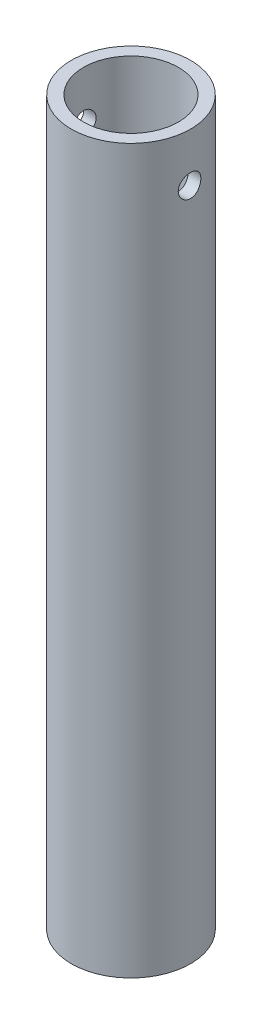
ISO-10303-21;
HEADER;
FILE_DESCRIPTION(('STEP AP214'),'2;1');
FILE_NAME('part.step','',(''),(''),'','','');
FILE_SCHEMA(('AUTOMOTIVE_DESIGN { 1 0 10303 214 1 1 1 1 }'));
ENDSEC;
DATA;
#1=APPLICATION_CONTEXT('core data for automotive mechanical design processes');
#2=APPLICATION_PROTOCOL_DEFINITION('international standard','automotive_design',2000,#1);
#3=PRODUCT_CONTEXT('',#1,'mechanical');
#4=PRODUCT('Part','Part','',(#3));
#5=PRODUCT_RELATED_PRODUCT_CATEGORY('part','',(#4));
#6=PRODUCT_DEFINITION_FORMATION('','',#4);
#7=PRODUCT_DEFINITION_CONTEXT('part definition',#1,'design');
#8=PRODUCT_DEFINITION('design','',#6,#7);
#9=PRODUCT_DEFINITION_SHAPE('','',#8);
#10=(LENGTH_UNIT() NAMED_UNIT(*) SI_UNIT(.MILLI.,.METRE.));
#11=(NAMED_UNIT(*) PLANE_ANGLE_UNIT() SI_UNIT($,.RADIAN.));
#12=(NAMED_UNIT(*) SI_UNIT($,.STERADIAN.) SOLID_ANGLE_UNIT());
#13=UNCERTAINTY_MEASURE_WITH_UNIT(LENGTH_MEASURE(1.E-05),#10,'distance_accuracy_value','');
#14=(GEOMETRIC_REPRESENTATION_CONTEXT(3) GLOBAL_UNCERTAINTY_ASSIGNED_CONTEXT((#13)) GLOBAL_UNIT_ASSIGNED_CONTEXT((#10,
#11,#12)) REPRESENTATION_CONTEXT('',''));
#15=CARTESIAN_POINT('',(0.,0.,0.));
#16=DIRECTION('',(0.,0.,1.));
#17=DIRECTION('',(1.,0.,0.));
#18=AXIS2_PLACEMENT_3D('',#15,#16,#17);
#19=CARTESIAN_POINT('',(-19.05,87.884,0.));
#20=DIRECTION('',(1.,0.,0.));
#21=DIRECTION('',(0.,1.,0.));
#22=AXIS2_PLACEMENT_3D('',#19,#20,#21);
#23=CYLINDRICAL_SURFACE('',#22,3.175);
#24=CARTESIAN_POINT('',(-16.4605914535292,87.884,3.175));
#25=CARTESIAN_POINT('',(-16.4605955713524,87.7075637329182,3.17499162485741));
#26=CARTESIAN_POINT('',(-16.4634616659425,87.5309061569688,3.16022982100423));
#27=CARTESIAN_POINT('',(-16.4746103196371,87.1824362642483,3.1015748491811));
#28=CARTESIAN_POINT('',(-16.482903712911,87.0106343576768,3.05762340919395));
#29=CARTESIAN_POINT('',(-16.5039342673924,86.6771743088839,2.94198525528433));
#30=CARTESIAN_POINT('',(-16.5166652590602,86.5155024492415,2.87033703286516));
#31=CARTESIAN_POINT('',(-16.5451282967864,86.206531513449,2.70143027149794));
#32=CARTESIAN_POINT('',(-16.5608593171774,86.0592275510576,2.60418048105422));
#33=CARTESIAN_POINT('',(-16.5937773870769,85.7812217923527,2.38549383997687));
#34=CARTESIAN_POINT('',(-16.6109790857533,85.6507301327012,2.26379199507614));
#35=CARTESIAN_POINT('',(-16.6447717073201,85.4118818070809,2.00022292090288));
#36=CARTESIAN_POINT('',(-16.661362557352,85.3035277745917,1.858353295883));
#37=CARTESIAN_POINT('',(-16.6922183889322,85.1112415233391,1.55711488166798));
#38=CARTESIAN_POINT('',(-16.7064643271996,85.0275052969996,1.39761886877199));
#39=CARTESIAN_POINT('',(-16.7308629866847,84.8880957175899,1.06650899254171));
#40=CARTESIAN_POINT('',(-16.7410160861486,84.8324197711653,0.894896250717597));
#41=CARTESIAN_POINT('',(-16.7559827785661,84.7513544187384,0.546580656825547));
#42=CARTESIAN_POINT('',(-16.7608582039182,84.7256140207742,0.369962193862704));
#43=CARTESIAN_POINT('',(-16.7649334075229,84.7040566116156,0.0148505250254451));
#44=CARTESIAN_POINT('',(-16.7641336694501,84.7082370503722,-0.163642519790199));
#45=CARTESIAN_POINT('',(-16.7569969250143,84.7461338255129,-0.51502699271231));
#46=CARTESIAN_POINT('',(-16.7507308248,84.7794719610584,-0.687960858224349));
#47=CARTESIAN_POINT('',(-16.7334449474204,84.8741398323728,-1.02573598186136));
#48=CARTESIAN_POINT('',(-16.722424957571,84.9354708205198,-1.19057687754778));
#49=CARTESIAN_POINT('',(-16.6967508581894,85.0847445535536,-1.50858464968854));
#50=CARTESIAN_POINT('',(-16.6820761381327,85.1728388694797,-1.66167864595414));
#51=CARTESIAN_POINT('',(-16.6507161755429,85.3730198639544,-1.95104063352492));
#52=CARTESIAN_POINT('',(-16.6340308745571,85.4851072401137,-2.08730813540932));
#53=CARTESIAN_POINT('',(-16.6001910903129,85.7321534616203,-2.34138006933843));
#54=CARTESIAN_POINT('',(-16.5830333416339,85.8674391747914,-2.45886641674243));
#55=CARTESIAN_POINT('',(-16.5504209365188,86.15603036559,-2.66958282596964));
#56=CARTESIAN_POINT('',(-16.5349670417288,86.309343839101,-2.76280206520241));
#57=CARTESIAN_POINT('',(-16.5075051510863,86.6301079940236,-2.92242577276076));
#58=CARTESIAN_POINT('',(-16.4955060391128,86.7975937145556,-2.98876128554039));
#59=CARTESIAN_POINT('',(-16.4764451364828,87.141395372795,-3.09212840865768));
#60=CARTESIAN_POINT('',(-16.4693729336149,87.3176918396095,-3.12922183930354));
#61=CARTESIAN_POINT('',(-16.4636506876963,87.5600912612585,-3.15910411285925));
#62=CARTESIAN_POINT('',(-16.4625061188877,87.6247154787923,-3.16506004880969));
#63=CARTESIAN_POINT('',(-16.4609757438165,87.7542164805012,-3.17300953582733));
#64=CARTESIAN_POINT('',(-16.4605899386794,87.8190932650508,-3.17500308101712));
#65=CARTESIAN_POINT('',(-16.4605955713524,88.0604362670817,-3.17499162485741));
#66=CARTESIAN_POINT('',(-16.4634616659425,88.2370938430311,-3.16022982100422));
#67=CARTESIAN_POINT('',(-16.4746103196371,88.5855637357516,-3.1015748491811));
#68=CARTESIAN_POINT('',(-16.482903712911,88.7573656423232,-3.05762340919395));
#69=CARTESIAN_POINT('',(-16.5039342673924,89.090825691116,-2.94198525528433));
#70=CARTESIAN_POINT('',(-16.5166652590602,89.2524975507584,-2.87033703286516));
#71=CARTESIAN_POINT('',(-16.5451282967864,89.5614684865509,-2.70143027149794));
#72=CARTESIAN_POINT('',(-16.5608593171774,89.7087724489423,-2.60418048105422));
#73=CARTESIAN_POINT('',(-16.5937773870769,89.9867782076472,-2.38549383997687));
#74=CARTESIAN_POINT('',(-16.6109790857533,90.1172698672987,-2.26379199507614));
#75=CARTESIAN_POINT('',(-16.6447717073201,90.356118192919,-2.00022292090288));
#76=CARTESIAN_POINT('',(-16.661362557352,90.4644722254083,-1.858353295883));
#77=CARTESIAN_POINT('',(-16.6922183889322,90.6567584766608,-1.55711488166798));
#78=CARTESIAN_POINT('',(-16.7064643271996,90.7404947030003,-1.39761886877198));
#79=CARTESIAN_POINT('',(-16.7308629866847,90.87990428241,-1.0665089925417));
#80=CARTESIAN_POINT('',(-16.7410160861486,90.9355802288347,-0.894896250717595));
#81=CARTESIAN_POINT('',(-16.7559827785661,91.0166455812615,-0.546580656825547));
#82=CARTESIAN_POINT('',(-16.7608582039182,91.0423859792257,-0.369962193862704));
#83=CARTESIAN_POINT('',(-16.7649334075229,91.0639433883843,-0.014850525025445));
#84=CARTESIAN_POINT('',(-16.7641336694501,91.0597629496277,0.163642519790199));
#85=CARTESIAN_POINT('',(-16.7569969250143,91.021866174487,0.51502699271231));
#86=CARTESIAN_POINT('',(-16.7507308248,90.9885280389415,0.687960858224349));
#87=CARTESIAN_POINT('',(-16.7334449474204,90.8938601676271,1.02573598186136));
#88=CARTESIAN_POINT('',(-16.722424957571,90.8325291794801,1.19057687754778));
#89=CARTESIAN_POINT('',(-16.6967508581894,90.6832554464463,1.50858464968854));
#90=CARTESIAN_POINT('',(-16.6820761381327,90.5951611305202,1.66167864595414));
#91=CARTESIAN_POINT('',(-16.6507161755429,90.3949801360455,1.95104063352492));
#92=CARTESIAN_POINT('',(-16.6340308745571,90.2828927598862,2.08730813540932));
#93=CARTESIAN_POINT('',(-16.6001910903129,90.0358465383796,2.34138006933844));
#94=CARTESIAN_POINT('',(-16.5830333416339,89.9005608252086,2.45886641674243));
#95=CARTESIAN_POINT('',(-16.5504209365188,89.6119696344099,2.66958282596964));
#96=CARTESIAN_POINT('',(-16.5349670417288,89.4586561608989,2.76280206520241));
#97=CARTESIAN_POINT('',(-16.5075051510863,89.1378920059763,2.92242577276077));
#98=CARTESIAN_POINT('',(-16.4955060391128,88.9704062854444,2.98876128554039));
#99=CARTESIAN_POINT('',(-16.4764451364828,88.626604627205,3.09212840865768));
#100=CARTESIAN_POINT('',(-16.4693729336149,88.4503081603904,3.12922183930354));
#101=CARTESIAN_POINT('',(-16.4636506876963,88.2079087387414,3.15910411285925));
#102=CARTESIAN_POINT('',(-16.4625061188877,88.1432845212076,3.16506004880969));
#103=CARTESIAN_POINT('',(-16.4609757438165,88.0137835194987,3.17300953582733));
#104=CARTESIAN_POINT('',(-16.4605899386794,87.9489067349491,3.17500308101712));
#105=CARTESIAN_POINT('',(-16.4605914535292,87.884,3.175));
#106=B_SPLINE_CURVE_WITH_KNOTS('',3,(#24,#25,#26,#27,#28,#29,#30,#31,#32,#33,#34,#35,#36,#37,
#38,#39,#40,#41,#42,#43,#44,#45,#46,#47,#48,#49,#50,#51,#52,#53,#54,#55,#56,#57,#58,#59,#60,#61,
#62,#63,#64,#65,#66,#67,#68,#69,#70,#71,#72,#73,#74,#75,#76,#77,#78,#79,#80,#81,#82,#83,#84,#85,
#86,#87,#88,#89,#90,#91,#92,#93,#94,#95,#96,#97,#98,#99,#100,#101,#102,#103,#104,#105),
.UNSPECIFIED.,.T.,.F.,(4,2,2,2,2,2,2,2,2,2,2,2,2,2,2,2,2,2,2,2,2,2,2,2,2,2,2,2,2,2,2,2,2,2,2,2,
2,2,2,2,4),(0.,0.529060607442751,1.05918057968992,1.5885664529977,2.11777166016638,
2.65305559998263,3.18840317984082,3.7279041202695,4.26735519042289,4.80041535553215,
5.33343009031626,5.85963201062706,6.38585747510327,6.91512054214377,7.44439899987461,
7.98186187797096,8.51956404349711,9.05863679237908,9.59656681525894,9.79119542677705,
9.98582432698736,10.5148849344301,11.0450049066773,11.574390779985,12.1035959871537,
12.63887992697,13.1742275068282,13.7137284472568,14.2531795174102,14.7862396825195,
15.3192544173036,15.8454563376144,16.3716818020906,16.9009448691311,17.430223326862,
17.9676862049583,18.5053883704845,19.0444611193664,19.5823911422463,19.7770197537644,
19.9716486539747),.UNSPECIFIED.);
#107=CARTESIAN_POINT('',(-16.4605914535292,87.884,3.175));
#108=VERTEX_POINT('',#107);
#109=EDGE_CURVE('E82',#108,#108,#106,.T.);
#110=ORIENTED_EDGE('',*,*,#109,.F.);
#111=EDGE_LOOP('',(#110));
#112=FACE_BOUND('',#111,.T.);
#113=CARTESIAN_POINT('',(-12.9515095645257,87.884,-3.175));
#114=CARTESIAN_POINT('',(-12.9515150321543,88.0594091033922,-3.17499110349409));
#115=CARTESIAN_POINT('',(-12.9551158878673,88.2350280599661,-3.16039928544589));
#116=CARTESIAN_POINT('',(-12.9691119406215,88.5813940737255,-3.1024524091018));
#117=CARTESIAN_POINT('',(-12.9795201677325,88.7521311309278,-3.05904218676037));
#118=CARTESIAN_POINT('',(-13.0058849015107,89.0834463566092,-2.94492512448011));
#119=CARTESIAN_POINT('',(-13.0218319038614,89.2440413740835,-2.87426502147401));
#120=CARTESIAN_POINT('',(-13.0574650521871,89.5510578474195,-2.70777495481837));
#121=CARTESIAN_POINT('',(-13.0771501936582,89.6974830950282,-2.61195175029665));
#122=CARTESIAN_POINT('',(-13.1184873948164,89.9750060808147,-2.39578966504888));
#123=CARTESIAN_POINT('',(-13.1401686144177,90.1057782933303,-2.27503831328109));
#124=CARTESIAN_POINT('',(-13.1828021034695,90.3454243938623,-2.01333114282377));
#125=CARTESIAN_POINT('',(-13.2037542695182,90.4542951859781,-1.87237247252157));
#126=CARTESIAN_POINT('',(-13.2428857484358,90.6483435411072,-1.57206281015363));
#127=CARTESIAN_POINT('',(-13.2610269464954,90.7332064826394,-1.41250312607639));
#128=CARTESIAN_POINT('',(-13.2921636292067,90.8747875015334,-1.0808821767031));
#129=CARTESIAN_POINT('',(-13.3051598413722,90.9315095583734,-0.908822682986226));
#130=CARTESIAN_POINT('',(-13.3243376644445,91.0141710410442,-0.560453850177033));
#131=CARTESIAN_POINT('',(-13.3306405683355,91.0406590416327,-0.384281469358428));
#132=CARTESIAN_POINT('',(-13.3361433306089,91.0638197526484,-0.0298881721607867));
#133=CARTESIAN_POINT('',(-13.3353441357289,91.0604964370407,0.148332468014021));
#134=CARTESIAN_POINT('',(-13.32682400396,91.0245290208186,0.497966067241963));
#135=CARTESIAN_POINT('',(-13.3192428286254,90.9924769307163,0.669443841416427));
#136=CARTESIAN_POINT('',(-13.2981718085659,90.9009097480018,1.00451495043173));
#137=CARTESIAN_POINT('',(-13.2846816269708,90.8413930896344,1.1681078351676));
#138=CARTESIAN_POINT('',(-13.253089742956,90.6960877605275,1.48436137691401));
#139=CARTESIAN_POINT('',(-13.2349501957408,90.6100822592147,1.63691847321283));
#140=CARTESIAN_POINT('',(-13.1960375214372,90.4144100777499,1.92563514925832));
#141=CARTESIAN_POINT('',(-13.1752641545099,90.3047412421469,2.06179323348657));
#142=CARTESIAN_POINT('',(-13.1327554217859,90.0616825070356,2.31736388145479));
#143=CARTESIAN_POINT('',(-13.1110089519818,89.927778707188,2.43628628346194));
#144=CARTESIAN_POINT('',(-13.0694641086944,89.641638086415,2.65013980561741));
#145=CARTESIAN_POINT('',(-13.0496666021758,89.4893931731068,2.74506027808236));
#146=CARTESIAN_POINT('',(-13.0142219462647,89.1699536961075,2.90848853384649));
#147=CARTESIAN_POINT('',(-12.9985952234592,89.0026907303876,2.97686704245557));
#148=CARTESIAN_POINT('',(-12.9735373309936,88.6587902073051,3.08425746944338));
#149=CARTESIAN_POINT('',(-12.9640931185848,88.4821732403046,3.12333123524721));
#150=CARTESIAN_POINT('',(-12.9560521978739,88.2341044219745,3.15642128515628));
#151=CARTESIAN_POINT('',(-12.9543531041202,88.164286071652,3.16338173213881));
#152=CARTESIAN_POINT('',(-12.9520806920144,88.0243230117147,3.17267287613199));
#153=CARTESIAN_POINT('',(-12.9515073770173,87.954178301128,3.17500355934588));
#154=CARTESIAN_POINT('',(-12.9515150321543,87.7085908966077,3.17499110349409));
#155=CARTESIAN_POINT('',(-12.9551158878673,87.5329719400338,3.16039928544589));
#156=CARTESIAN_POINT('',(-12.9691119406215,87.1866059262744,3.1024524091018));
#157=CARTESIAN_POINT('',(-12.9795201677325,87.0158688690722,3.05904218676037));
#158=CARTESIAN_POINT('',(-13.0058849015107,86.6845536433907,2.94492512448011));
#159=CARTESIAN_POINT('',(-13.0218319038614,86.5239586259164,2.87426502147401));
#160=CARTESIAN_POINT('',(-13.0574650521871,86.2169421525804,2.70777495481837));
#161=CARTESIAN_POINT('',(-13.0771501936582,86.0705169049717,2.61195175029665));
#162=CARTESIAN_POINT('',(-13.1184873948164,85.7929939191852,2.39578966504888));
#163=CARTESIAN_POINT('',(-13.1401686144177,85.6622217066696,2.27503831328109));
#164=CARTESIAN_POINT('',(-13.1828021034695,85.4225756061376,2.01333114282377));
#165=CARTESIAN_POINT('',(-13.2037542695182,85.3137048140218,1.87237247252157));
#166=CARTESIAN_POINT('',(-13.2428857484358,85.1196564588927,1.57206281015362));
#167=CARTESIAN_POINT('',(-13.2610269464954,85.0347935173605,1.41250312607639));
#168=CARTESIAN_POINT('',(-13.2921636292067,84.8932124984666,1.0808821767031));
#169=CARTESIAN_POINT('',(-13.3051598413722,84.8364904416265,0.908822682986224));
#170=CARTESIAN_POINT('',(-13.3243376644445,84.7538289589557,0.560453850177034));
#171=CARTESIAN_POINT('',(-13.3306405683355,84.7273409583672,0.384281469358429));
#172=CARTESIAN_POINT('',(-13.3361433306089,84.7041802473515,0.0298881721607874));
#173=CARTESIAN_POINT('',(-13.3353441357289,84.7075035629592,-0.148332468014021));
#174=CARTESIAN_POINT('',(-13.32682400396,84.7434709791814,-0.497966067241963));
#175=CARTESIAN_POINT('',(-13.3192428286254,84.7755230692837,-0.669443841416427));
#176=CARTESIAN_POINT('',(-13.2981718085659,84.8670902519981,-1.00451495043173));
#177=CARTESIAN_POINT('',(-13.2846816269708,84.9266069103655,-1.1681078351676));
#178=CARTESIAN_POINT('',(-13.253089742956,85.0719122394725,-1.48436137691401));
#179=CARTESIAN_POINT('',(-13.2349501957408,85.1579177407852,-1.63691847321283));
#180=CARTESIAN_POINT('',(-13.1960375214372,85.35358992225,-1.92563514925832));
#181=CARTESIAN_POINT('',(-13.1752641545099,85.463258757853,-2.06179323348657));
#182=CARTESIAN_POINT('',(-13.1327554217859,85.7063174929643,-2.31736388145478));
#183=CARTESIAN_POINT('',(-13.1110089519818,85.8402212928119,-2.43628628346193));
#184=CARTESIAN_POINT('',(-13.0694641086944,86.1263619135849,-2.6501398056174));
#185=CARTESIAN_POINT('',(-13.0496666021758,86.2786068268931,-2.74506027808235));
#186=CARTESIAN_POINT('',(-13.0142219462647,86.5980463038924,-2.90848853384649));
#187=CARTESIAN_POINT('',(-12.9985952234592,86.7653092696124,-2.97686704245557));
#188=CARTESIAN_POINT('',(-12.9735373309936,87.1092097926948,-3.08425746944338));
#189=CARTESIAN_POINT('',(-12.9640931185848,87.2858267596953,-3.12333123524721));
#190=CARTESIAN_POINT('',(-12.9560521978739,87.5338955780254,-3.15642128515628));
#191=CARTESIAN_POINT('',(-12.9543531041202,87.6037139283479,-3.16338173213881));
#192=CARTESIAN_POINT('',(-12.9520806920144,87.7436769882853,-3.17267287613199));
#193=CARTESIAN_POINT('',(-12.9515073770173,87.813821698872,-3.17500355934588));
#194=CARTESIAN_POINT('',(-12.9515095645257,87.884,-3.175));
#195=B_SPLINE_CURVE_WITH_KNOTS('',3,(#113,#114,#115,#116,#117,#118,#119,#120,#121,#122,#123,
#124,#125,#126,#127,#128,#129,#130,#131,#132,#133,#134,#135,#136,#137,#138,#139,#140,#141,#142,
#143,#144,#145,#146,#147,#148,#149,#150,#151,#152,#153,#154,#155,#156,#157,#158,#159,#160,#161,
#162,#163,#164,#165,#166,#167,#168,#169,#170,#171,#172,#173,#174,#175,#176,#177,#178,#179,#180,
#181,#182,#183,#184,#185,#186,#187,#188,#189,#190,#191,#192,#193,#194),.UNSPECIFIED.,.T.,.F.,(4,
2,2,2,2,2,2,2,2,2,2,2,2,2,2,2,2,2,2,2,2,2,2,2,2,2,2,2,2,2,2,2,2,2,2,2,2,2,2,2,4),(0.,
0.52595793685034,1.05292557398116,1.57899338711993,2.10492003606811,2.64036920450116,
3.17589400886909,3.71814216305199,4.26031361459001,4.7924830697087,5.32458158561023,
5.84596107397576,6.36737028986368,6.89316646475828,7.41901055372315,7.95769665664759,
8.49662131272434,9.03813885838204,9.57851029438349,9.78893679885166,9.99936393039224,
10.5253218672426,11.0522895043734,11.5783573175122,12.1042839664604,12.6397331348934,
13.1752579392613,13.7175060934442,14.2596775449823,14.7918470001009,15.3239455160025,
15.845325004368,16.3667342202559,16.8925303951505,17.4183744841154,17.9570605870398,
18.4959852431166,19.0375027887743,19.5778742247757,19.7883007292439,19.9987278607845),.UNSPECIFIED.);
#196=CARTESIAN_POINT('',(-12.9515095645257,87.884,-3.175));
#197=VERTEX_POINT('',#196);
#198=EDGE_CURVE('E9',#197,#197,#195,.T.);
#199=ORIENTED_EDGE('',*,*,#198,.T.);
#200=EDGE_LOOP('',(#199));
#201=FACE_BOUND('',#200,.T.);
#202=ADVANCED_FACE('F14',(#112,#201),#23,.F.);
#203=CARTESIAN_POINT('',(-19.05,87.884,0.));
#204=DIRECTION('',(1.,0.,0.));
#205=DIRECTION('',(0.,1.,0.));
#206=AXIS2_PLACEMENT_3D('',#203,#204,#205);
#207=CYLINDRICAL_SURFACE('',#206,3.175);
#208=CARTESIAN_POINT('',(12.9515095645257,87.884,-3.175));
#209=CARTESIAN_POINT('',(12.9515150321543,87.7085908966078,-3.1749911034941));
#210=CARTESIAN_POINT('',(12.9551158878673,87.5329719400339,-3.1603992854459));
#211=CARTESIAN_POINT('',(12.9691119406215,87.1866059262745,-3.10245240910182));
#212=CARTESIAN_POINT('',(12.9795201677325,87.0158688690722,-3.05904218676039));
#213=CARTESIAN_POINT('',(13.0058849015107,86.6845536433908,-2.94492512448014));
#214=CARTESIAN_POINT('',(13.0218319038614,86.5239586259165,-2.87426502147405));
#215=CARTESIAN_POINT('',(13.0574650521871,86.2169421525805,-2.70777495481842));
#216=CARTESIAN_POINT('',(13.0771501936582,86.0705169049718,-2.6119517502967));
#217=CARTESIAN_POINT('',(13.1184873948164,85.7929939191853,-2.39578966504894));
#218=CARTESIAN_POINT('',(13.1401686144177,85.6622217066697,-2.27503831328115));
#219=CARTESIAN_POINT('',(13.1828021034695,85.4225756061377,-2.01333114282383));
#220=CARTESIAN_POINT('',(13.2037542695182,85.3137048140219,-1.87237247252165));
#221=CARTESIAN_POINT('',(13.2428857484358,85.1196564588927,-1.57206281015371));
#222=CARTESIAN_POINT('',(13.2610269464954,85.0347935173606,-1.41250312607647));
#223=CARTESIAN_POINT('',(13.2921636292067,84.8932124984666,-1.08088217670318));
#224=CARTESIAN_POINT('',(13.3051598413722,84.8364904416265,-0.908822682986317));
#225=CARTESIAN_POINT('',(13.3243376644445,84.7538289589557,-0.56045385017713));
#226=CARTESIAN_POINT('',(13.3306405683355,84.7273409583672,-0.384281469358524));
#227=CARTESIAN_POINT('',(13.3361433306089,84.7041802473515,-0.0298881721608809));
#228=CARTESIAN_POINT('',(13.3353441357289,84.7075035629592,0.148332468013927));
#229=CARTESIAN_POINT('',(13.32682400396,84.7434709791814,0.497966067241871));
#230=CARTESIAN_POINT('',(13.3192428286254,84.7755230692837,0.669443841416338));
#231=CARTESIAN_POINT('',(13.2981718085659,84.8670902519981,1.00451495043164));
#232=CARTESIAN_POINT('',(13.2846816269708,84.9266069103655,1.16810783516751));
#233=CARTESIAN_POINT('',(13.253089742956,85.0719122394724,1.48436137691393));
#234=CARTESIAN_POINT('',(13.2349501957408,85.1579177407852,1.63691847321275));
#235=CARTESIAN_POINT('',(13.1960375214372,85.35358992225,1.92563514925825));
#236=CARTESIAN_POINT('',(13.1752641545099,85.463258757853,2.06179323348651));
#237=CARTESIAN_POINT('',(13.1327554217859,85.7063174929643,2.31736388145474));
#238=CARTESIAN_POINT('',(13.1110089519818,85.8402212928119,2.43628628346189));
#239=CARTESIAN_POINT('',(13.0694641086944,86.1263619135849,2.65013980561737));
#240=CARTESIAN_POINT('',(13.0496666021758,86.2786068268931,2.74506027808231));
#241=CARTESIAN_POINT('',(13.0142219462647,86.5980463038923,2.90848853384645));
#242=CARTESIAN_POINT('',(12.9985952234592,86.7653092696123,2.97686704245554));
#243=CARTESIAN_POINT('',(12.9735373309936,87.1092097926947,3.08425746944335));
#244=CARTESIAN_POINT('',(12.9640931185848,87.2858267596952,3.12333123524719));
#245=CARTESIAN_POINT('',(12.9560521978739,87.5338955780253,3.15642128515627));
#246=CARTESIAN_POINT('',(12.9543531041202,87.6037139283479,3.16338173213881));
#247=CARTESIAN_POINT('',(12.9520806920144,87.7436769882852,3.17267287613199));
#248=CARTESIAN_POINT('',(12.9515073770173,87.813821698872,3.17500355934588));
#249=CARTESIAN_POINT('',(12.9515150321543,88.0594091033922,3.17499110349409));
#250=CARTESIAN_POINT('',(12.9551158878673,88.2350280599661,3.16039928544589));
#251=CARTESIAN_POINT('',(12.9691119406215,88.5813940737255,3.1024524091018));
#252=CARTESIAN_POINT('',(12.9795201677325,88.7521311309278,3.05904218676037));
#253=CARTESIAN_POINT('',(13.0058849015107,89.0834463566092,2.94492512448011));
#254=CARTESIAN_POINT('',(13.0218319038614,89.2440413740835,2.87426502147401));
#255=CARTESIAN_POINT('',(13.0574650521871,89.5510578474195,2.70777495481837));
#256=CARTESIAN_POINT('',(13.0771501936582,89.6974830950282,2.61195175029665));
#257=CARTESIAN_POINT('',(13.1184873948164,89.9750060808147,2.39578966504888));
#258=CARTESIAN_POINT('',(13.1401686144177,90.1057782933303,2.27503831328109));
#259=CARTESIAN_POINT('',(13.1828021034695,90.3454243938623,2.01333114282377));
#260=CARTESIAN_POINT('',(13.2037542695182,90.4542951859781,1.87237247252157));
#261=CARTESIAN_POINT('',(13.2428857484358,90.6483435411072,1.57206281015363));
#262=CARTESIAN_POINT('',(13.2610269464954,90.7332064826394,1.41250312607639));
#263=CARTESIAN_POINT('',(13.2921636292067,90.8747875015334,1.0808821767031));
#264=CARTESIAN_POINT('',(13.3051598413722,90.9315095583734,0.908822682986225));
#265=CARTESIAN_POINT('',(13.3243376644445,91.0141710410442,0.560453850177033));
#266=CARTESIAN_POINT('',(13.3306405683355,91.0406590416327,0.384281469358428));
#267=CARTESIAN_POINT('',(13.3361433306089,91.0638197526484,0.0298881721607862));
#268=CARTESIAN_POINT('',(13.3353441357289,91.0604964370407,-0.148332468014022));
#269=CARTESIAN_POINT('',(13.32682400396,91.0245290208186,-0.497966067241962));
#270=CARTESIAN_POINT('',(13.3192428286254,90.9924769307163,-0.669443841416426));
#271=CARTESIAN_POINT('',(13.2981718085659,90.9009097480018,-1.00451495043173));
#272=CARTESIAN_POINT('',(13.2846816269708,90.8413930896344,-1.1681078351676));
#273=CARTESIAN_POINT('',(13.253089742956,90.6960877605275,-1.48436137691401));
#274=CARTESIAN_POINT('',(13.2349501957408,90.6100822592147,-1.63691847321283));
#275=CARTESIAN_POINT('',(13.1960375214372,90.4144100777499,-1.92563514925832));
#276=CARTESIAN_POINT('',(13.1752641545099,90.3047412421469,-2.06179323348657));
#277=CARTESIAN_POINT('',(13.1327554217859,90.0616825070356,-2.31736388145479));
#278=CARTESIAN_POINT('',(13.1110089519818,89.927778707188,-2.43628628346195));
#279=CARTESIAN_POINT('',(13.0694641086944,89.641638086415,-2.65013980561741));
#280=CARTESIAN_POINT('',(13.0496666021758,89.4893931731068,-2.74506027808236));
#281=CARTESIAN_POINT('',(13.0142219462647,89.1699536961075,-2.90848853384649));
#282=CARTESIAN_POINT('',(12.9985952234592,89.0026907303876,-2.97686704245557));
#283=CARTESIAN_POINT('',(12.9735373309936,88.6587902073051,-3.08425746944338));
#284=CARTESIAN_POINT('',(12.9640931185847,88.4821732403046,-3.12333123524721));
#285=CARTESIAN_POINT('',(12.9560521978739,88.2341044219745,-3.15642128515628));
#286=CARTESIAN_POINT('',(12.9543531041202,88.164286071652,-3.16338173213881));
#287=CARTESIAN_POINT('',(12.9520806920144,88.0243230117147,-3.17267287613198));
#288=CARTESIAN_POINT('',(12.9515073770173,87.954178301128,-3.17500355934588));
#289=CARTESIAN_POINT('',(12.9515095645257,87.884,-3.175));
#290=B_SPLINE_CURVE_WITH_KNOTS('',3,(#208,#209,#210,#211,#212,#213,#214,#215,#216,#217,#218,
#219,#220,#221,#222,#223,#224,#225,#226,#227,#228,#229,#230,#231,#232,#233,#234,#235,#236,#237,
#238,#239,#240,#241,#242,#243,#244,#245,#246,#247,#248,#249,#250,#251,#252,#253,#254,#255,#256,
#257,#258,#259,#260,#261,#262,#263,#264,#265,#266,#267,#268,#269,#270,#271,#272,#273,#274,#275,
#276,#277,#278,#279,#280,#281,#282,#283,#284,#285,#286,#287,#288,#289),.UNSPECIFIED.,.T.,.F.,(4,
2,2,2,2,2,2,2,2,2,2,2,2,2,2,2,2,2,2,2,2,2,2,2,2,2,2,2,2,2,2,2,2,2,2,2,2,2,2,2,4),(0.,
0.525957936850339,1.05292557398114,1.57899338711992,2.10492003606809,2.64036920450113,
3.17589400886907,3.71814216305197,4.26031361458998,4.79248306970868,5.32458158561021,
5.84596107397574,6.36737028986366,6.89316646475826,7.41901055372314,7.95769665664759,
8.49662131272432,9.03813885838201,9.57851029438348,9.78893679885169,9.99936393039231,
10.5253218672427,11.0522895043735,11.5783573175122,12.1042839664604,12.6397331348935,
13.1752579392614,13.7175060934443,14.2596775449823,14.791847000101,15.3239455160025,
15.8453250043681,16.366734220256,16.8925303951506,17.4183744841155,17.9570605870399,
18.4959852431166,19.0375027887744,19.5778742247758,19.7883007292439,19.9987278607845),.UNSPECIFIED.);
#291=CARTESIAN_POINT('',(12.9515095645257,87.884,-3.175));
#292=VERTEX_POINT('',#291);
#293=EDGE_CURVE('E23',#292,#292,#290,.T.);
#294=ORIENTED_EDGE('',*,*,#293,.T.);
#295=EDGE_LOOP('',(#294));
#296=FACE_BOUND('',#295,.T.);
#297=CARTESIAN_POINT('',(16.4605914535292,87.884,3.175));
#298=CARTESIAN_POINT('',(16.4605955713524,88.0604362670817,3.17499162485741));
#299=CARTESIAN_POINT('',(16.4634616659425,88.2370938430311,3.16022982100423));
#300=CARTESIAN_POINT('',(16.4746103196371,88.5855637357516,3.1015748491811));
#301=CARTESIAN_POINT('',(16.482903712911,88.7573656423232,3.05762340919395));
#302=CARTESIAN_POINT('',(16.5039342673924,89.090825691116,2.94198525528433));
#303=CARTESIAN_POINT('',(16.5166652590602,89.2524975507584,2.87033703286516));
#304=CARTESIAN_POINT('',(16.5451282967864,89.5614684865509,2.70143027149794));
#305=CARTESIAN_POINT('',(16.5608593171774,89.7087724489423,2.60418048105422));
#306=CARTESIAN_POINT('',(16.5937773870769,89.9867782076472,2.38549383997687));
#307=CARTESIAN_POINT('',(16.6109790857533,90.1172698672987,2.26379199507614));
#308=CARTESIAN_POINT('',(16.6447717073201,90.356118192919,2.00022292090288));
#309=CARTESIAN_POINT('',(16.661362557352,90.4644722254083,1.858353295883));
#310=CARTESIAN_POINT('',(16.6922183889322,90.6567584766608,1.55711488166798));
#311=CARTESIAN_POINT('',(16.7064643271996,90.7404947030003,1.39761886877199));
#312=CARTESIAN_POINT('',(16.7308629866847,90.87990428241,1.06650899254171));
#313=CARTESIAN_POINT('',(16.7410160861486,90.9355802288347,0.894896250717597));
#314=CARTESIAN_POINT('',(16.7559827785661,91.0166455812615,0.546580656825547));
#315=CARTESIAN_POINT('',(16.7608582039182,91.0423859792257,0.369962193862704));
#316=CARTESIAN_POINT('',(16.7649334075229,91.0639433883843,0.0148505250254451));
#317=CARTESIAN_POINT('',(16.7641336694501,91.0597629496277,-0.163642519790199));
#318=CARTESIAN_POINT('',(16.7569969250143,91.021866174487,-0.51502699271231));
#319=CARTESIAN_POINT('',(16.7507308248,90.9885280389415,-0.687960858224349));
#320=CARTESIAN_POINT('',(16.7334449474204,90.8938601676271,-1.02573598186136));
#321=CARTESIAN_POINT('',(16.722424957571,90.8325291794801,-1.19057687754778));
#322=CARTESIAN_POINT('',(16.6967508581894,90.6832554464463,-1.50858464968854));
#323=CARTESIAN_POINT('',(16.6820761381327,90.5951611305202,-1.66167864595413));
#324=CARTESIAN_POINT('',(16.6507161755429,90.3949801360455,-1.95104063352492));
#325=CARTESIAN_POINT('',(16.6340308745571,90.2828927598862,-2.08730813540932));
#326=CARTESIAN_POINT('',(16.6001910903129,90.0358465383796,-2.34138006933844));
#327=CARTESIAN_POINT('',(16.5830333416339,89.9005608252086,-2.45886641674243));
#328=CARTESIAN_POINT('',(16.5504209365188,89.6119696344099,-2.66958282596964));
#329=CARTESIAN_POINT('',(16.5349670417288,89.4586561608989,-2.76280206520241));
#330=CARTESIAN_POINT('',(16.5075051510863,89.1378920059763,-2.92242577276077));
#331=CARTESIAN_POINT('',(16.4955060391128,88.9704062854444,-2.98876128554039));
#332=CARTESIAN_POINT('',(16.4764451364828,88.626604627205,-3.09212840865768));
#333=CARTESIAN_POINT('',(16.4693729336149,88.4503081603904,-3.12922183930354));
#334=CARTESIAN_POINT('',(16.4636506876963,88.2079087387414,-3.15910411285925));
#335=CARTESIAN_POINT('',(16.4625061188877,88.1432845212076,-3.16506004880969));
#336=CARTESIAN_POINT('',(16.4609757438165,88.0137835194988,-3.17300953582733));
#337=CARTESIAN_POINT('',(16.4605899386794,87.9489067349492,-3.17500308101712));
#338=CARTESIAN_POINT('',(16.4605955713524,87.7075637329183,-3.17499162485741));
#339=CARTESIAN_POINT('',(16.4634616659425,87.5309061569689,-3.16022982100423));
#340=CARTESIAN_POINT('',(16.474610319637,87.1824362642484,-3.10157484918111));
#341=CARTESIAN_POINT('',(16.482903712911,87.0106343576768,-3.05762340919397));
#342=CARTESIAN_POINT('',(16.5039342673924,86.677174308884,-2.94198525528436));
#343=CARTESIAN_POINT('',(16.5166652590602,86.5155024492416,-2.8703370328652));
#344=CARTESIAN_POINT('',(16.5451282967864,86.2065315134491,-2.70143027149798));
#345=CARTESIAN_POINT('',(16.5608593171774,86.0592275510577,-2.60418048105428));
#346=CARTESIAN_POINT('',(16.5937773870768,85.7812217923527,-2.38549383997693));
#347=CARTESIAN_POINT('',(16.6109790857533,85.6507301327012,-2.2637919950762));
#348=CARTESIAN_POINT('',(16.6447717073201,85.411881807081,-2.00022292090295));
#349=CARTESIAN_POINT('',(16.661362557352,85.3035277745917,-1.85835329588307));
#350=CARTESIAN_POINT('',(16.6922183889322,85.1112415233391,-1.55711488166805));
#351=CARTESIAN_POINT('',(16.7064643271996,85.0275052969996,-1.39761886877206));
#352=CARTESIAN_POINT('',(16.7308629866847,84.88809571759,-1.06650899254178));
#353=CARTESIAN_POINT('',(16.7410160861486,84.8324197711653,-0.89489625071767));
#354=CARTESIAN_POINT('',(16.7559827785661,84.7513544187384,-0.546580656825623));
#355=CARTESIAN_POINT('',(16.7608582039182,84.7256140207742,-0.369962193862782));
#356=CARTESIAN_POINT('',(16.7649334075229,84.7040566116156,-0.0148505250255243));
#357=CARTESIAN_POINT('',(16.7641336694501,84.7082370503722,0.163642519790121));
#358=CARTESIAN_POINT('',(16.7569969250143,84.7461338255129,0.515026992712234));
#359=CARTESIAN_POINT('',(16.7507308248,84.7794719610583,0.687960858224275));
#360=CARTESIAN_POINT('',(16.7334449474204,84.8741398323728,1.02573598186129));
#361=CARTESIAN_POINT('',(16.722424957571,84.9354708205198,1.19057687754771));
#362=CARTESIAN_POINT('',(16.6967508581894,85.0847445535536,1.50858464968848));
#363=CARTESIAN_POINT('',(16.6820761381327,85.1728388694797,1.66167864595407));
#364=CARTESIAN_POINT('',(16.6507161755429,85.3730198639543,1.95104063352486));
#365=CARTESIAN_POINT('',(16.6340308745571,85.4851072401136,2.08730813540927));
#366=CARTESIAN_POINT('',(16.6001910903129,85.7321534616202,2.34138006933839));
#367=CARTESIAN_POINT('',(16.5830333416339,85.8674391747913,2.45886641674238));
#368=CARTESIAN_POINT('',(16.5504209365188,86.15603036559,2.6695828259696));
#369=CARTESIAN_POINT('',(16.5349670417288,86.309343839101,2.76280206520237));
#370=CARTESIAN_POINT('',(16.5075051510863,86.6301079940236,2.92242577276074));
#371=CARTESIAN_POINT('',(16.4955060391128,86.7975937145555,2.98876128554037));
#372=CARTESIAN_POINT('',(16.4764451364828,87.1413953727949,3.09212840865767));
#373=CARTESIAN_POINT('',(16.4693729336149,87.3176918396095,3.12922183930352));
#374=CARTESIAN_POINT('',(16.4636506876963,87.5600912612585,3.15910411285925));
#375=CARTESIAN_POINT('',(16.4625061188877,87.6247154787923,3.16506004880969));
#376=CARTESIAN_POINT('',(16.4609757438165,87.7542164805012,3.17300953582733));
#377=CARTESIAN_POINT('',(16.4605899386794,87.8190932650508,3.17500308101712));
#378=CARTESIAN_POINT('',(16.4605914535292,87.884,3.175));
#379=B_SPLINE_CURVE_WITH_KNOTS('',3,(#297,#298,#299,#300,#301,#302,#303,#304,#305,#306,#307,
#308,#309,#310,#311,#312,#313,#314,#315,#316,#317,#318,#319,#320,#321,#322,#323,#324,#325,#326,
#327,#328,#329,#330,#331,#332,#333,#334,#335,#336,#337,#338,#339,#340,#341,#342,#343,#344,#345,
#346,#347,#348,#349,#350,#351,#352,#353,#354,#355,#356,#357,#358,#359,#360,#361,#362,#363,#364,
#365,#366,#367,#368,#369,#370,#371,#372,#373,#374,#375,#376,#377,#378),.UNSPECIFIED.,.T.,.F.,(4,
2,2,2,2,2,2,2,2,2,2,2,2,2,2,2,2,2,2,2,2,2,2,2,2,2,2,2,2,2,2,2,2,2,2,2,2,2,2,2,4),(0.,
0.529060607442751,1.05918057968992,1.5885664529977,2.11777166016638,2.65305559998263,
3.18840317984082,3.7279041202695,4.26735519042289,4.80041535553215,5.33343009031626,
5.85963201062706,6.38585747510327,6.91512054214377,7.44439899987461,7.98186187797098,
8.51956404349711,9.05863679237908,9.59656681525894,9.79119542677702,9.98582432698728,
10.51488493443,11.0450049066772,11.5743907799849,12.1035959871536,12.6388799269699,
13.1742275068281,13.7137284472568,14.2531795174101,14.7862396825194,15.3192544173035,
15.8454563376143,16.3716818020905,16.900944869131,17.4302233268619,17.9676862049582,
18.5053883704844,19.0444611193663,19.5823911422462,19.7770197537644,19.9716486539747),.UNSPECIFIED.);
#380=CARTESIAN_POINT('',(16.4605914535292,87.884,3.175));
#381=VERTEX_POINT('',#380);
#382=EDGE_CURVE('E50',#381,#381,#379,.T.);
#383=ORIENTED_EDGE('',*,*,#382,.F.);
#384=EDGE_LOOP('',(#383));
#385=FACE_BOUND('',#384,.T.);
#386=ADVANCED_FACE('F42',(#296,#385),#207,.F.);
#387=CARTESIAN_POINT('',(0.,101.6,0.));
#388=DIRECTION('',(0.,-1.,0.));
#389=DIRECTION('',(0.,0.,-1.));
#390=AXIS2_PLACEMENT_3D('',#387,#388,#389);
#391=CYLINDRICAL_SURFACE('',#390,13.335);
#392=CARTESIAN_POINT('',(0.,101.6,0.));
#393=DIRECTION('',(0.,1.,0.));
#394=DIRECTION('',(0.,0.,1.));
#395=AXIS2_PLACEMENT_3D('',#392,#393,#394);
#396=CIRCLE('',#395,13.335);
#397=CARTESIAN_POINT('',(0.,101.6,13.335));
#398=VERTEX_POINT('',#397);
#399=EDGE_CURVE('E28',#398,#398,#396,.T.);
#400=ORIENTED_EDGE('',*,*,#399,.T.);
#401=EDGE_LOOP('',(#400));
#402=FACE_BOUND('',#401,.T.);
#403=ORIENTED_EDGE('',*,*,#293,.F.);
#404=EDGE_LOOP('',(#403));
#405=FACE_BOUND('',#404,.T.);
#406=CARTESIAN_POINT('',(0.,-101.6,0.));
#407=DIRECTION('',(0.,1.,0.));
#408=DIRECTION('',(0.,0.,1.));
#409=AXIS2_PLACEMENT_3D('',#406,#407,#408);
#410=CIRCLE('',#409,13.335);
#411=CARTESIAN_POINT('',(0.,-101.6,13.335));
#412=VERTEX_POINT('',#411);
#413=EDGE_CURVE('E19',#412,#412,#410,.T.);
#414=ORIENTED_EDGE('',*,*,#413,.F.);
#415=EDGE_LOOP('',(#414));
#416=FACE_BOUND('',#415,.T.);
#417=ORIENTED_EDGE('',*,*,#198,.F.);
#418=EDGE_LOOP('',(#417));
#419=FACE_BOUND('',#418,.T.);
#420=ADVANCED_FACE('F39',(#402,#405,#416,#419),#391,.F.);
#421=CARTESIAN_POINT('',(0.,101.6,0.));
#422=DIRECTION('',(0.,-1.,0.));
#423=DIRECTION('',(0.,0.,-1.));
#424=AXIS2_PLACEMENT_3D('',#421,#422,#423);
#425=CYLINDRICAL_SURFACE('',#424,16.764);
#426=CARTESIAN_POINT('',(0.,101.6,0.));
#427=DIRECTION('',(0.,1.,0.));
#428=DIRECTION('',(0.,0.,1.));
#429=AXIS2_PLACEMENT_3D('',#426,#427,#428);
#430=CIRCLE('',#429,16.764);
#431=CARTESIAN_POINT('',(0.,101.6,16.764));
#432=VERTEX_POINT('',#431);
#433=EDGE_CURVE('E56',#432,#432,#430,.T.);
#434=ORIENTED_EDGE('',*,*,#433,.F.);
#435=EDGE_LOOP('',(#434));
#436=FACE_BOUND('',#435,.T.);
#437=ORIENTED_EDGE('',*,*,#109,.T.);
#438=EDGE_LOOP('',(#437));
#439=FACE_BOUND('',#438,.T.);
#440=CARTESIAN_POINT('',(0.,-101.6,0.));
#441=DIRECTION('',(0.,1.,0.));
#442=DIRECTION('',(0.,0.,1.));
#443=AXIS2_PLACEMENT_3D('',#440,#441,#442);
#444=CIRCLE('',#443,16.764);
#445=CARTESIAN_POINT('',(0.,-101.6,16.764));
#446=VERTEX_POINT('',#445);
#447=EDGE_CURVE('E55',#446,#446,#444,.T.);
#448=ORIENTED_EDGE('',*,*,#447,.T.);
#449=EDGE_LOOP('',(#448));
#450=FACE_BOUND('',#449,.T.);
#451=ORIENTED_EDGE('',*,*,#382,.T.);
#452=EDGE_LOOP('',(#451));
#453=FACE_BOUND('',#452,.T.);
#454=ADVANCED_FACE('F16',(#436,#439,#450,#453),#425,.T.);
#455=CARTESIAN_POINT('',(0.,101.6,0.));
#456=DIRECTION('',(0.,1.,0.));
#457=DIRECTION('',(0.,0.,1.));
#458=AXIS2_PLACEMENT_3D('',#455,#456,#457);
#459=PLANE('',#458);
#460=ORIENTED_EDGE('',*,*,#433,.T.);
#461=EDGE_LOOP('',(#460));
#462=FACE_BOUND('',#461,.T.);
#463=ORIENTED_EDGE('',*,*,#399,.F.);
#464=EDGE_LOOP('',(#463));
#465=FACE_BOUND('',#464,.T.);
#466=ADVANCED_FACE('F68',(#462,#465),#459,.T.);
#467=CARTESIAN_POINT('',(0.,-101.6,0.));
#468=DIRECTION('',(0.,1.,0.));
#469=DIRECTION('',(0.,0.,1.));
#470=AXIS2_PLACEMENT_3D('',#467,#468,#469);
#471=PLANE('',#470);
#472=ORIENTED_EDGE('',*,*,#447,.F.);
#473=EDGE_LOOP('',(#472));
#474=FACE_BOUND('',#473,.T.);
#475=ORIENTED_EDGE('',*,*,#413,.T.);
#476=EDGE_LOOP('',(#475));
#477=FACE_BOUND('',#476,.T.);
#478=ADVANCED_FACE('F64',(#474,#477),#471,.F.);
#479=CLOSED_SHELL('',(#202,#386,#420,#454,#466,#478));
#480=MANIFOLD_SOLID_BREP('B1',#479);
#481=ADVANCED_BREP_SHAPE_REPRESENTATION('',(#18,#480),#14);
#482=SHAPE_DEFINITION_REPRESENTATION(#9,#481);
ENDSEC;
END-ISO-10303-21;
